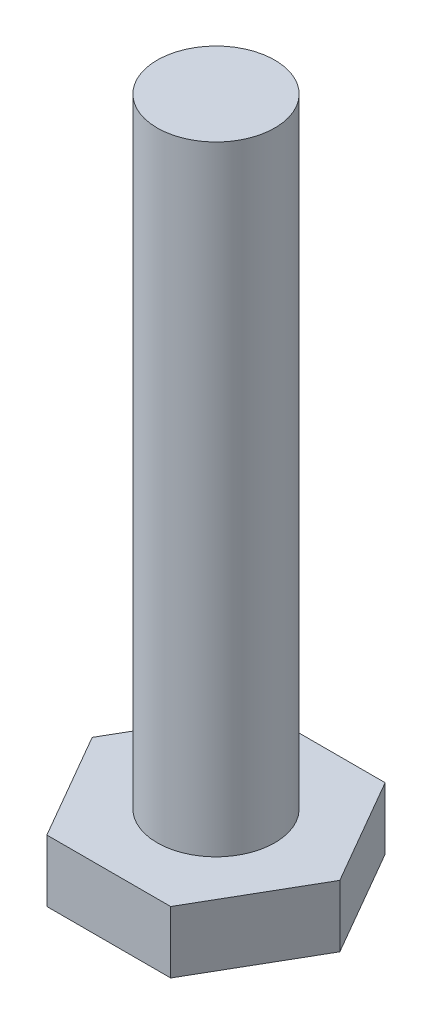
ISO-10303-21;
HEADER;
FILE_DESCRIPTION(('STEP AP214'),'2;1');
FILE_NAME('part.step','',(''),(''),'','','');
FILE_SCHEMA(('AUTOMOTIVE_DESIGN { 1 0 10303 214 1 1 1 1 }'));
ENDSEC;
DATA;
#1=APPLICATION_CONTEXT('core data for automotive mechanical design processes');
#2=APPLICATION_PROTOCOL_DEFINITION('international standard','automotive_design',2000,#1);
#3=PRODUCT_CONTEXT('',#1,'mechanical');
#4=PRODUCT('Part','Part','',(#3));
#5=PRODUCT_RELATED_PRODUCT_CATEGORY('part','',(#4));
#6=PRODUCT_DEFINITION_FORMATION('','',#4);
#7=PRODUCT_DEFINITION_CONTEXT('part definition',#1,'design');
#8=PRODUCT_DEFINITION('design','',#6,#7);
#9=PRODUCT_DEFINITION_SHAPE('','',#8);
#10=(LENGTH_UNIT() NAMED_UNIT(*) SI_UNIT(.MILLI.,.METRE.));
#11=(NAMED_UNIT(*) PLANE_ANGLE_UNIT() SI_UNIT($,.RADIAN.));
#12=(NAMED_UNIT(*) SI_UNIT($,.STERADIAN.) SOLID_ANGLE_UNIT());
#13=UNCERTAINTY_MEASURE_WITH_UNIT(LENGTH_MEASURE(1.E-05),#10,'distance_accuracy_value','');
#14=(GEOMETRIC_REPRESENTATION_CONTEXT(3) GLOBAL_UNCERTAINTY_ASSIGNED_CONTEXT((#13)) GLOBAL_UNIT_ASSIGNED_CONTEXT((#10,
#11,#12)) REPRESENTATION_CONTEXT('',''));
#15=CARTESIAN_POINT('',(0.,0.,0.));
#16=DIRECTION('',(0.,0.,1.));
#17=DIRECTION('',(1.,0.,0.));
#18=AXIS2_PLACEMENT_3D('',#15,#16,#17);
#19=CARTESIAN_POINT('',(0.,5.,0.));
#20=DIRECTION('',(0.,1.,0.));
#21=DIRECTION('',(0.,0.,1.));
#22=AXIS2_PLACEMENT_3D('',#19,#20,#21);
#23=PLANE('',#22);
#24=DIRECTION('',(0.499999999999999,0.,-0.866025403784439));
#25=VECTOR('',#24,1.);
#26=CARTESIAN_POINT('',(5.,5.,8.66025403784439));
#27=LINE('',#26,#25);
#28=CARTESIAN_POINT('',(5.,5.,8.66025403784439));
#29=VERTEX_POINT('',#28);
#30=CARTESIAN_POINT('',(10.,5.,0.));
#31=VERTEX_POINT('',#30);
#32=EDGE_CURVE('E133',#29,#31,#27,.T.);
#33=ORIENTED_EDGE('',*,*,#32,.T.);
#34=DIRECTION('',(-0.5,0.,-0.866025403784438));
#35=VECTOR('',#34,1.);
#36=CARTESIAN_POINT('',(10.,5.,0.));
#37=LINE('',#36,#35);
#38=CARTESIAN_POINT('',(5.,5.,-8.66025403784439));
#39=VERTEX_POINT('',#38);
#40=EDGE_CURVE('E91',#31,#39,#37,.T.);
#41=ORIENTED_EDGE('',*,*,#40,.T.);
#42=DIRECTION('',(-1.,0.,0.));
#43=VECTOR('',#42,1.);
#44=CARTESIAN_POINT('',(5.,5.,-8.66025403784439));
#45=LINE('',#44,#43);
#46=CARTESIAN_POINT('',(-5.,5.,-8.66025403784439));
#47=VERTEX_POINT('',#46);
#48=EDGE_CURVE('E104',#39,#47,#45,.T.);
#49=ORIENTED_EDGE('',*,*,#48,.T.);
#50=DIRECTION('',(-0.5,0.,0.866025403784439));
#51=VECTOR('',#50,1.);
#52=CARTESIAN_POINT('',(-5.,5.,-8.66025403784439));
#53=LINE('',#52,#51);
#54=CARTESIAN_POINT('',(-10.,5.,0.));
#55=VERTEX_POINT('',#54);
#56=EDGE_CURVE('E98',#47,#55,#53,.T.);
#57=ORIENTED_EDGE('',*,*,#56,.T.);
#58=DIRECTION('',(0.5,0.,0.866025403784439));
#59=VECTOR('',#58,1.);
#60=CARTESIAN_POINT('',(-10.,5.,0.));
#61=LINE('',#60,#59);
#62=CARTESIAN_POINT('',(-5.,5.,8.66025403784439));
#63=VERTEX_POINT('',#62);
#64=EDGE_CURVE('E102',#55,#63,#61,.T.);
#65=ORIENTED_EDGE('',*,*,#64,.T.);
#66=DIRECTION('',(1.,0.,0.));
#67=VECTOR('',#66,1.);
#68=CARTESIAN_POINT('',(-5.,5.,8.66025403784439));
#69=LINE('',#68,#67);
#70=EDGE_CURVE('E54',#63,#29,#69,.T.);
#71=ORIENTED_EDGE('',*,*,#70,.T.);
#72=EDGE_LOOP('',(#33,#41,#49,#57,#65,#71));
#73=FACE_BOUND('',#72,.T.);
#74=CARTESIAN_POINT('',(0.,5.,0.));
#75=DIRECTION('',(0.,1.,0.));
#76=DIRECTION('',(0.,0.,1.));
#77=AXIS2_PLACEMENT_3D('',#74,#75,#76);
#78=CIRCLE('',#77,4.75);
#79=CARTESIAN_POINT('',(0.,5.,4.75));
#80=VERTEX_POINT('',#79);
#81=EDGE_CURVE('E126',#80,#80,#78,.T.);
#82=ORIENTED_EDGE('',*,*,#81,.F.);
#83=EDGE_LOOP('',(#82));
#84=FACE_BOUND('',#83,.T.);
#85=ADVANCED_FACE('F37',(#73,#84),#23,.T.);
#86=CARTESIAN_POINT('',(0.,0.,0.));
#87=DIRECTION('',(0.,1.,0.));
#88=DIRECTION('',(0.,0.,1.));
#89=AXIS2_PLACEMENT_3D('',#86,#87,#88);
#90=PLANE('',#89);
#91=DIRECTION('',(0.499999999999999,0.,-0.866025403784439));
#92=VECTOR('',#91,1.);
#93=CARTESIAN_POINT('',(5.,0.,8.66025403784439));
#94=LINE('',#93,#92);
#95=CARTESIAN_POINT('',(5.,0.,8.66025403784439));
#96=VERTEX_POINT('',#95);
#97=CARTESIAN_POINT('',(10.,0.,0.));
#98=VERTEX_POINT('',#97);
#99=EDGE_CURVE('E122',#96,#98,#94,.T.);
#100=ORIENTED_EDGE('',*,*,#99,.F.);
#101=DIRECTION('',(1.,0.,0.));
#102=VECTOR('',#101,1.);
#103=CARTESIAN_POINT('',(-5.,0.,8.66025403784439));
#104=LINE('',#103,#102);
#105=CARTESIAN_POINT('',(-5.,0.,8.66025403784439));
#106=VERTEX_POINT('',#105);
#107=EDGE_CURVE('E83',#106,#96,#104,.T.);
#108=ORIENTED_EDGE('',*,*,#107,.F.);
#109=DIRECTION('',(0.5,0.,0.866025403784439));
#110=VECTOR('',#109,1.);
#111=CARTESIAN_POINT('',(-10.,0.,0.));
#112=LINE('',#111,#110);
#113=CARTESIAN_POINT('',(-10.,0.,0.));
#114=VERTEX_POINT('',#113);
#115=EDGE_CURVE('E77',#114,#106,#112,.T.);
#116=ORIENTED_EDGE('',*,*,#115,.F.);
#117=DIRECTION('',(-0.5,0.,0.866025403784439));
#118=VECTOR('',#117,1.);
#119=CARTESIAN_POINT('',(-5.,0.,-8.66025403784439));
#120=LINE('',#119,#118);
#121=CARTESIAN_POINT('',(-5.,0.,-8.66025403784439));
#122=VERTEX_POINT('',#121);
#123=EDGE_CURVE('E112',#122,#114,#120,.T.);
#124=ORIENTED_EDGE('',*,*,#123,.F.);
#125=DIRECTION('',(-1.,0.,0.));
#126=VECTOR('',#125,1.);
#127=CARTESIAN_POINT('',(5.,0.,-8.66025403784439));
#128=LINE('',#127,#126);
#129=CARTESIAN_POINT('',(5.,0.,-8.66025403784439));
#130=VERTEX_POINT('',#129);
#131=EDGE_CURVE('E128',#130,#122,#128,.T.);
#132=ORIENTED_EDGE('',*,*,#131,.F.);
#133=DIRECTION('',(-0.5,0.,-0.866025403784438));
#134=VECTOR('',#133,1.);
#135=CARTESIAN_POINT('',(10.,0.,0.));
#136=LINE('',#135,#134);
#137=EDGE_CURVE('E125',#98,#130,#136,.T.);
#138=ORIENTED_EDGE('',*,*,#137,.F.);
#139=EDGE_LOOP('',(#100,#108,#116,#124,#132,#138));
#140=FACE_BOUND('',#139,.T.);
#141=ADVANCED_FACE('F142',(#140),#90,.F.);
#142=CARTESIAN_POINT('',(5.,5.,8.66025403784439));
#143=DIRECTION('',(-0.866025403784439,0.,-0.5));
#144=DIRECTION('',(-0.5,0.,0.866025403784439));
#145=AXIS2_PLACEMENT_3D('',#142,#143,#144);
#146=PLANE('',#145);
#147=ORIENTED_EDGE('',*,*,#99,.T.);
#148=DIRECTION('',(0.,-1.,0.));
#149=VECTOR('',#148,1.);
#150=CARTESIAN_POINT('',(10.,5.,0.));
#151=LINE('',#150,#149);
#152=EDGE_CURVE('E11',#31,#98,#151,.T.);
#153=ORIENTED_EDGE('',*,*,#152,.F.);
#154=ORIENTED_EDGE('',*,*,#32,.F.);
#155=DIRECTION('',(0.,-1.,0.));
#156=VECTOR('',#155,1.);
#157=CARTESIAN_POINT('',(5.,5.,8.66025403784439));
#158=LINE('',#157,#156);
#159=EDGE_CURVE('E118',#29,#96,#158,.T.);
#160=ORIENTED_EDGE('',*,*,#159,.T.);
#161=EDGE_LOOP('',(#147,#153,#154,#160));
#162=FACE_BOUND('',#161,.T.);
#163=ADVANCED_FACE('F39',(#162),#146,.F.);
#164=CARTESIAN_POINT('',(10.,5.,0.));
#165=DIRECTION('',(-0.866025403784438,0.,0.5));
#166=DIRECTION('',(0.5,0.,0.866025403784439));
#167=AXIS2_PLACEMENT_3D('',#164,#165,#166);
#168=PLANE('',#167);
#169=ORIENTED_EDGE('',*,*,#137,.T.);
#170=DIRECTION('',(0.,-1.,0.));
#171=VECTOR('',#170,1.);
#172=CARTESIAN_POINT('',(5.,5.,-8.66025403784439));
#173=LINE('',#172,#171);
#174=EDGE_CURVE('E46',#39,#130,#173,.T.);
#175=ORIENTED_EDGE('',*,*,#174,.F.);
#176=ORIENTED_EDGE('',*,*,#40,.F.);
#177=ORIENTED_EDGE('',*,*,#152,.T.);
#178=EDGE_LOOP('',(#169,#175,#176,#177));
#179=FACE_BOUND('',#178,.T.);
#180=ADVANCED_FACE('F218',(#179),#168,.F.);
#181=CARTESIAN_POINT('',(5.,5.,-8.66025403784439));
#182=DIRECTION('',(0.,0.,1.));
#183=DIRECTION('',(1.,0.,0.));
#184=AXIS2_PLACEMENT_3D('',#181,#182,#183);
#185=PLANE('',#184);
#186=ORIENTED_EDGE('',*,*,#131,.T.);
#187=DIRECTION('',(0.,-1.,0.));
#188=VECTOR('',#187,1.);
#189=CARTESIAN_POINT('',(-5.,5.,-8.66025403784439));
#190=LINE('',#189,#188);
#191=EDGE_CURVE('E113',#47,#122,#190,.T.);
#192=ORIENTED_EDGE('',*,*,#191,.F.);
#193=ORIENTED_EDGE('',*,*,#48,.F.);
#194=ORIENTED_EDGE('',*,*,#174,.T.);
#195=EDGE_LOOP('',(#186,#192,#193,#194));
#196=FACE_BOUND('',#195,.T.);
#197=ADVANCED_FACE('F139',(#196),#185,.F.);
#198=CARTESIAN_POINT('',(-5.,5.,-8.66025403784439));
#199=DIRECTION('',(0.866025403784439,0.,0.5));
#200=DIRECTION('',(0.5,0.,-0.866025403784439));
#201=AXIS2_PLACEMENT_3D('',#198,#199,#200);
#202=PLANE('',#201);
#203=ORIENTED_EDGE('',*,*,#123,.T.);
#204=DIRECTION('',(0.,-1.,0.));
#205=VECTOR('',#204,1.);
#206=CARTESIAN_POINT('',(-10.,5.,0.));
#207=LINE('',#206,#205);
#208=EDGE_CURVE('E109',#55,#114,#207,.T.);
#209=ORIENTED_EDGE('',*,*,#208,.F.);
#210=ORIENTED_EDGE('',*,*,#56,.F.);
#211=ORIENTED_EDGE('',*,*,#191,.T.);
#212=EDGE_LOOP('',(#203,#209,#210,#211));
#213=FACE_BOUND('',#212,.T.);
#214=ADVANCED_FACE('F110',(#213),#202,.F.);
#215=CARTESIAN_POINT('',(-10.,5.,0.));
#216=DIRECTION('',(0.866025403784438,0.,-0.5));
#217=DIRECTION('',(-0.5,0.,-0.866025403784439));
#218=AXIS2_PLACEMENT_3D('',#215,#216,#217);
#219=PLANE('',#218);
#220=ORIENTED_EDGE('',*,*,#115,.T.);
#221=DIRECTION('',(0.,-1.,0.));
#222=VECTOR('',#221,1.);
#223=CARTESIAN_POINT('',(-5.,5.,8.66025403784439));
#224=LINE('',#223,#222);
#225=EDGE_CURVE('E114',#63,#106,#224,.T.);
#226=ORIENTED_EDGE('',*,*,#225,.F.);
#227=ORIENTED_EDGE('',*,*,#64,.F.);
#228=ORIENTED_EDGE('',*,*,#208,.T.);
#229=EDGE_LOOP('',(#220,#226,#227,#228));
#230=FACE_BOUND('',#229,.T.);
#231=ADVANCED_FACE('F116',(#230),#219,.F.);
#232=CARTESIAN_POINT('',(-5.,5.,8.66025403784439));
#233=DIRECTION('',(0.,0.,-1.));
#234=DIRECTION('',(-1.,0.,0.));
#235=AXIS2_PLACEMENT_3D('',#232,#233,#234);
#236=PLANE('',#235);
#237=ORIENTED_EDGE('',*,*,#107,.T.);
#238=ORIENTED_EDGE('',*,*,#159,.F.);
#239=ORIENTED_EDGE('',*,*,#70,.F.);
#240=ORIENTED_EDGE('',*,*,#225,.T.);
#241=EDGE_LOOP('',(#237,#238,#239,#240));
#242=FACE_BOUND('',#241,.T.);
#243=ADVANCED_FACE('F146',(#242),#236,.F.);
#244=CARTESIAN_POINT('',(0.,55.,0.));
#245=DIRECTION('',(0.,-1.,0.));
#246=DIRECTION('',(0.,0.,-1.));
#247=AXIS2_PLACEMENT_3D('',#244,#245,#246);
#248=CYLINDRICAL_SURFACE('',#247,4.75);
#249=ORIENTED_EDGE('',*,*,#81,.T.);
#250=EDGE_LOOP('',(#249));
#251=FACE_BOUND('',#250,.T.);
#252=CARTESIAN_POINT('',(0.,55.,0.));
#253=DIRECTION('',(0.,1.,0.));
#254=DIRECTION('',(0.,0.,1.));
#255=AXIS2_PLACEMENT_3D('',#252,#253,#254);
#256=CIRCLE('',#255,4.75);
#257=CARTESIAN_POINT('',(0.,55.,4.75));
#258=VERTEX_POINT('',#257);
#259=EDGE_CURVE('E171',#258,#258,#256,.T.);
#260=ORIENTED_EDGE('',*,*,#259,.F.);
#261=EDGE_LOOP('',(#260));
#262=FACE_BOUND('',#261,.T.);
#263=ADVANCED_FACE('F148',(#251,#262),#248,.T.);
#264=CARTESIAN_POINT('',(0.,55.,0.));
#265=DIRECTION('',(0.,1.,0.));
#266=DIRECTION('',(0.,0.,1.));
#267=AXIS2_PLACEMENT_3D('',#264,#265,#266);
#268=PLANE('',#267);
#269=ORIENTED_EDGE('',*,*,#259,.T.);
#270=EDGE_LOOP('',(#269));
#271=FACE_BOUND('',#270,.T.);
#272=ADVANCED_FACE('F154',(#271),#268,.T.);
#273=CLOSED_SHELL('',(#85,#141,#163,#180,#197,#214,#231,#243,#263,#272));
#274=MANIFOLD_SOLID_BREP('B2',#273);
#275=ADVANCED_BREP_SHAPE_REPRESENTATION('',(#18,#274),#14);
#276=SHAPE_DEFINITION_REPRESENTATION(#9,#275);
ENDSEC;
END-ISO-10303-21;
